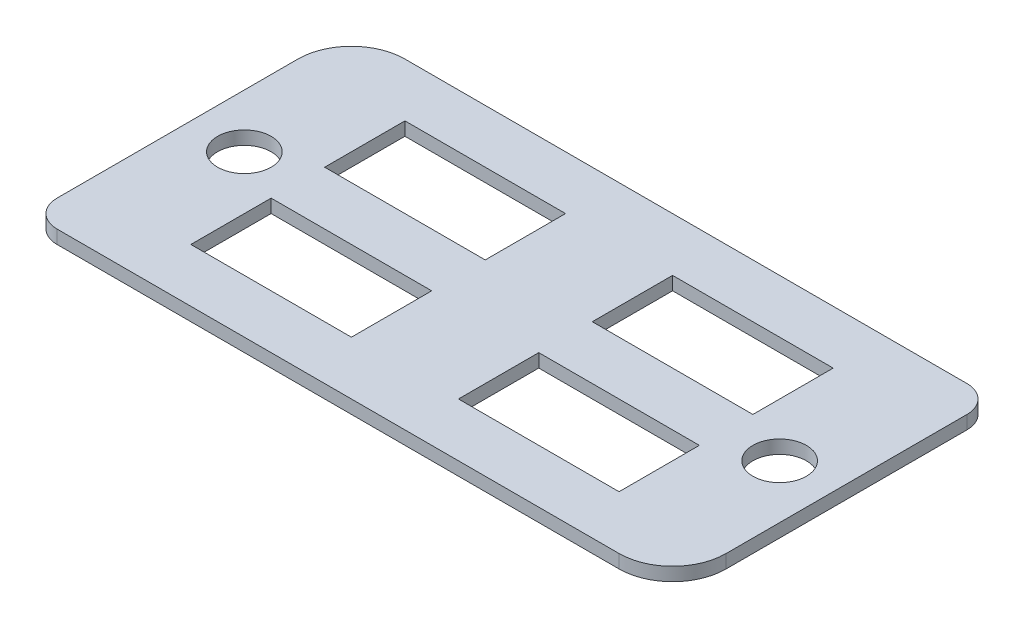
ISO-10303-21;
HEADER;
FILE_DESCRIPTION(('STEP AP214'),'2;1');
FILE_NAME('part.step','',(''),(''),'','','');
FILE_SCHEMA(('AUTOMOTIVE_DESIGN { 1 0 10303 214 1 1 1 1 }'));
ENDSEC;
DATA;
#1=APPLICATION_CONTEXT('core data for automotive mechanical design processes');
#2=APPLICATION_PROTOCOL_DEFINITION('international standard','automotive_design',2000,#1);
#3=PRODUCT_CONTEXT('',#1,'mechanical');
#4=PRODUCT('Part','Part','',(#3));
#5=PRODUCT_RELATED_PRODUCT_CATEGORY('part','',(#4));
#6=PRODUCT_DEFINITION_FORMATION('','',#4);
#7=PRODUCT_DEFINITION_CONTEXT('part definition',#1,'design');
#8=PRODUCT_DEFINITION('design','',#6,#7);
#9=PRODUCT_DEFINITION_SHAPE('','',#8);
#10=(LENGTH_UNIT() NAMED_UNIT(*) SI_UNIT(.MILLI.,.METRE.));
#11=(NAMED_UNIT(*) PLANE_ANGLE_UNIT() SI_UNIT($,.RADIAN.));
#12=(NAMED_UNIT(*) SI_UNIT($,.STERADIAN.) SOLID_ANGLE_UNIT());
#13=UNCERTAINTY_MEASURE_WITH_UNIT(LENGTH_MEASURE(1.E-05),#10,'distance_accuracy_value','');
#14=(GEOMETRIC_REPRESENTATION_CONTEXT(3) GLOBAL_UNCERTAINTY_ASSIGNED_CONTEXT((#13)) GLOBAL_UNIT_ASSIGNED_CONTEXT((#10,
#11,#12)) REPRESENTATION_CONTEXT('',''));
#15=CARTESIAN_POINT('',(0.,0.,0.));
#16=DIRECTION('',(0.,0.,1.));
#17=DIRECTION('',(1.,0.,0.));
#18=AXIS2_PLACEMENT_3D('',#15,#16,#17);
#19=CARTESIAN_POINT('',(0.,6.35,0.));
#20=DIRECTION('',(0.,-1.,0.));
#21=DIRECTION('',(0.,0.,-1.));
#22=AXIS2_PLACEMENT_3D('',#19,#20,#21);
#23=PLANE('',#22);
#24=DIRECTION('',(0.,0.,1.));
#25=VECTOR('',#24,1.);
#26=CARTESIAN_POINT('',(177.8,6.35,-127.));
#27=LINE('',#26,#25);
#28=CARTESIAN_POINT('',(177.8,6.35,-127.));
#29=VERTEX_POINT('',#28);
#30=CARTESIAN_POINT('',(177.8,6.35,-88.9));
#31=VERTEX_POINT('',#30);
#32=EDGE_CURVE('E236',#29,#31,#27,.T.);
#33=ORIENTED_EDGE('',*,*,#32,.F.);
#34=DIRECTION('',(-1.,0.,0.));
#35=VECTOR('',#34,1.);
#36=CARTESIAN_POINT('',(177.8,6.35,-127.));
#37=LINE('',#36,#35);
#38=CARTESIAN_POINT('',(254.,6.35,-127.));
#39=VERTEX_POINT('',#38);
#40=EDGE_CURVE('E244',#39,#29,#37,.T.);
#41=ORIENTED_EDGE('',*,*,#40,.F.);
#42=DIRECTION('',(0.,0.,-1.));
#43=VECTOR('',#42,1.);
#44=CARTESIAN_POINT('',(254.,6.35,-127.));
#45=LINE('',#44,#43);
#46=CARTESIAN_POINT('',(254.,6.35,-88.9));
#47=VERTEX_POINT('',#46);
#48=EDGE_CURVE('E241',#47,#39,#45,.T.);
#49=ORIENTED_EDGE('',*,*,#48,.F.);
#50=DIRECTION('',(1.,0.,0.));
#51=VECTOR('',#50,1.);
#52=CARTESIAN_POINT('',(177.8,6.35,-88.9));
#53=LINE('',#52,#51);
#54=EDGE_CURVE('E238',#31,#47,#53,.T.);
#55=ORIENTED_EDGE('',*,*,#54,.F.);
#56=EDGE_LOOP('',(#33,#41,#49,#55));
#57=FACE_BOUND('',#56,.T.);
#58=CARTESIAN_POINT('',(25.4,6.35,-76.2));
#59=DIRECTION('',(0.,1.,0.));
#60=DIRECTION('',(0.,0.,1.));
#61=AXIS2_PLACEMENT_3D('',#58,#59,#60);
#62=CIRCLE('',#61,12.7);
#63=CARTESIAN_POINT('',(25.4,6.35,-63.5));
#64=VERTEX_POINT('',#63);
#65=EDGE_CURVE('E304',#64,#64,#62,.T.);
#66=ORIENTED_EDGE('',*,*,#65,.F.);
#67=EDGE_LOOP('',(#66));
#68=FACE_BOUND('',#67,.T.);
#69=DIRECTION('',(0.,0.,1.));
#70=VECTOR('',#69,1.);
#71=CARTESIAN_POINT('',(50.8,6.35,-127.));
#72=LINE('',#71,#70);
#73=CARTESIAN_POINT('',(50.8,6.35,-127.));
#74=VERTEX_POINT('',#73);
#75=CARTESIAN_POINT('',(50.8,6.35,-88.9));
#76=VERTEX_POINT('',#75);
#77=EDGE_CURVE('E310',#74,#76,#72,.T.);
#78=ORIENTED_EDGE('',*,*,#77,.F.);
#79=DIRECTION('',(-1.,0.,0.));
#80=VECTOR('',#79,1.);
#81=CARTESIAN_POINT('',(50.8,6.35,-127.));
#82=LINE('',#81,#80);
#83=CARTESIAN_POINT('',(127.,6.35,-127.));
#84=VERTEX_POINT('',#83);
#85=EDGE_CURVE('E318',#84,#74,#82,.T.);
#86=ORIENTED_EDGE('',*,*,#85,.F.);
#87=DIRECTION('',(0.,0.,-1.));
#88=VECTOR('',#87,1.);
#89=CARTESIAN_POINT('',(127.,6.35,-127.));
#90=LINE('',#89,#88);
#91=CARTESIAN_POINT('',(127.,6.35,-88.9));
#92=VERTEX_POINT('',#91);
#93=EDGE_CURVE('E315',#92,#84,#90,.T.);
#94=ORIENTED_EDGE('',*,*,#93,.F.);
#95=DIRECTION('',(1.,0.,0.));
#96=VECTOR('',#95,1.);
#97=CARTESIAN_POINT('',(50.8,6.35,-88.9));
#98=LINE('',#97,#96);
#99=EDGE_CURVE('E312',#76,#92,#98,.T.);
#100=ORIENTED_EDGE('',*,*,#99,.F.);
#101=EDGE_LOOP('',(#78,#86,#94,#100));
#102=FACE_BOUND('',#101,.T.);
#103=DIRECTION('',(0.,0.,-1.));
#104=VECTOR('',#103,1.);
#105=CARTESIAN_POINT('',(304.8,6.35,0.));
#106=LINE('',#105,#104);
#107=CARTESIAN_POINT('',(304.8,6.35,-25.4));
#108=VERTEX_POINT('',#107);
#109=CARTESIAN_POINT('',(304.8,6.35,-139.7));
#110=VERTEX_POINT('',#109);
#111=EDGE_CURVE('E346',#108,#110,#106,.T.);
#112=ORIENTED_EDGE('',*,*,#111,.T.);
#113=CARTESIAN_POINT('',(292.1,6.35,-139.7));
#114=DIRECTION('',(0.,-1.,0.));
#115=DIRECTION('',(0.,0.,-1.));
#116=AXIS2_PLACEMENT_3D('',#113,#114,#115);
#117=CIRCLE('',#116,12.7);
#118=CARTESIAN_POINT('',(292.1,6.35,-152.4));
#119=VERTEX_POINT('',#118);
#120=EDGE_CURVE('E390',#110,#119,#117,.F.);
#121=ORIENTED_EDGE('',*,*,#120,.T.);
#122=DIRECTION('',(-1.,0.,0.));
#123=VECTOR('',#122,1.);
#124=CARTESIAN_POINT('',(0.,6.35,-152.4));
#125=LINE('',#124,#123);
#126=CARTESIAN_POINT('',(25.4,6.35,-152.4));
#127=VERTEX_POINT('',#126);
#128=EDGE_CURVE('E349',#119,#127,#125,.T.);
#129=ORIENTED_EDGE('',*,*,#128,.T.);
#130=CARTESIAN_POINT('',(25.4,6.35,-127.));
#131=DIRECTION('',(0.,-1.,0.));
#132=DIRECTION('',(0.,0.,-1.));
#133=AXIS2_PLACEMENT_3D('',#130,#131,#132);
#134=CIRCLE('',#133,25.4);
#135=CARTESIAN_POINT('',(0.,6.35,-127.));
#136=VERTEX_POINT('',#135);
#137=EDGE_CURVE('E370',#127,#136,#134,.F.);
#138=ORIENTED_EDGE('',*,*,#137,.T.);
#139=DIRECTION('',(0.,0.,1.));
#140=VECTOR('',#139,1.);
#141=CARTESIAN_POINT('',(0.,6.35,0.));
#142=LINE('',#141,#140);
#143=CARTESIAN_POINT('',(0.,6.35,-12.7));
#144=VERTEX_POINT('',#143);
#145=EDGE_CURVE('E341',#136,#144,#142,.T.);
#146=ORIENTED_EDGE('',*,*,#145,.T.);
#147=CARTESIAN_POINT('',(12.7,6.35,-12.7));
#148=DIRECTION('',(0.,-1.,0.));
#149=DIRECTION('',(0.,0.,-1.));
#150=AXIS2_PLACEMENT_3D('',#147,#148,#149);
#151=CIRCLE('',#150,12.7);
#152=CARTESIAN_POINT('',(12.7,6.35,0.));
#153=VERTEX_POINT('',#152);
#154=EDGE_CURVE('E53',#144,#153,#151,.F.);
#155=ORIENTED_EDGE('',*,*,#154,.T.);
#156=DIRECTION('',(1.,0.,0.));
#157=VECTOR('',#156,1.);
#158=CARTESIAN_POINT('',(0.,6.35,0.));
#159=LINE('',#158,#157);
#160=CARTESIAN_POINT('',(279.4,6.35,0.));
#161=VERTEX_POINT('',#160);
#162=EDGE_CURVE('E343',#153,#161,#159,.T.);
#163=ORIENTED_EDGE('',*,*,#162,.T.);
#164=CARTESIAN_POINT('',(279.4,6.35,-25.4));
#165=DIRECTION('',(0.,-1.,0.));
#166=DIRECTION('',(0.,0.,-1.));
#167=AXIS2_PLACEMENT_3D('',#164,#165,#166);
#168=CIRCLE('',#167,25.4);
#169=EDGE_CURVE('E372',#161,#108,#168,.F.);
#170=ORIENTED_EDGE('',*,*,#169,.T.);
#171=EDGE_LOOP('',(#112,#121,#129,#138,#146,#155,#163,#170));
#172=FACE_BOUND('',#171,.T.);
#173=DIRECTION('',(0.,0.,1.));
#174=VECTOR('',#173,1.);
#175=CARTESIAN_POINT('',(50.8,6.35,-63.5));
#176=LINE('',#175,#174);
#177=CARTESIAN_POINT('',(50.8,6.35,-63.5));
#178=VERTEX_POINT('',#177);
#179=CARTESIAN_POINT('',(50.8,6.35,-25.4));
#180=VERTEX_POINT('',#179);
#181=EDGE_CURVE('E273',#178,#180,#176,.T.);
#182=ORIENTED_EDGE('',*,*,#181,.F.);
#183=DIRECTION('',(-1.,0.,0.));
#184=VECTOR('',#183,1.);
#185=CARTESIAN_POINT('',(50.8,6.35,-63.5));
#186=LINE('',#185,#184);
#187=CARTESIAN_POINT('',(127.,6.35,-63.5));
#188=VERTEX_POINT('',#187);
#189=EDGE_CURVE('E281',#188,#178,#186,.T.);
#190=ORIENTED_EDGE('',*,*,#189,.F.);
#191=DIRECTION('',(0.,0.,-1.));
#192=VECTOR('',#191,1.);
#193=CARTESIAN_POINT('',(127.,6.35,-63.5));
#194=LINE('',#193,#192);
#195=CARTESIAN_POINT('',(127.,6.35,-25.4));
#196=VERTEX_POINT('',#195);
#197=EDGE_CURVE('E278',#196,#188,#194,.T.);
#198=ORIENTED_EDGE('',*,*,#197,.F.);
#199=DIRECTION('',(1.,0.,0.));
#200=VECTOR('',#199,1.);
#201=CARTESIAN_POINT('',(50.8,6.35,-25.4));
#202=LINE('',#201,#200);
#203=EDGE_CURVE('E275',#180,#196,#202,.T.);
#204=ORIENTED_EDGE('',*,*,#203,.F.);
#205=EDGE_LOOP('',(#182,#190,#198,#204));
#206=FACE_BOUND('',#205,.T.);
#207=CARTESIAN_POINT('',(279.4,6.35,-76.2));
#208=DIRECTION('',(0.,1.,0.));
#209=DIRECTION('',(0.,0.,1.));
#210=AXIS2_PLACEMENT_3D('',#207,#208,#209);
#211=CIRCLE('',#210,12.7);
#212=CARTESIAN_POINT('',(279.4,6.35,-63.5));
#213=VERTEX_POINT('',#212);
#214=EDGE_CURVE('E267',#213,#213,#211,.T.);
#215=ORIENTED_EDGE('',*,*,#214,.F.);
#216=EDGE_LOOP('',(#215));
#217=FACE_BOUND('',#216,.T.);
#218=DIRECTION('',(0.,0.,1.));
#219=VECTOR('',#218,1.);
#220=CARTESIAN_POINT('',(177.8,6.35,-63.5));
#221=LINE('',#220,#219);
#222=CARTESIAN_POINT('',(177.8,6.35,-63.5));
#223=VERTEX_POINT('',#222);
#224=CARTESIAN_POINT('',(177.8,6.35,-25.4));
#225=VERTEX_POINT('',#224);
#226=EDGE_CURVE('E195',#223,#225,#221,.T.);
#227=ORIENTED_EDGE('',*,*,#226,.F.);
#228=DIRECTION('',(-1.,0.,0.));
#229=VECTOR('',#228,1.);
#230=CARTESIAN_POINT('',(177.8,6.35,-63.5));
#231=LINE('',#230,#229);
#232=CARTESIAN_POINT('',(254.,6.35,-63.5));
#233=VERTEX_POINT('',#232);
#234=EDGE_CURVE('E220',#233,#223,#231,.T.);
#235=ORIENTED_EDGE('',*,*,#234,.F.);
#236=DIRECTION('',(0.,0.,-1.));
#237=VECTOR('',#236,1.);
#238=CARTESIAN_POINT('',(254.,6.35,-63.5));
#239=LINE('',#238,#237);
#240=CARTESIAN_POINT('',(254.,6.35,-25.4));
#241=VERTEX_POINT('',#240);
#242=EDGE_CURVE('E218',#241,#233,#239,.T.);
#243=ORIENTED_EDGE('',*,*,#242,.F.);
#244=DIRECTION('',(1.,0.,0.));
#245=VECTOR('',#244,1.);
#246=CARTESIAN_POINT('',(177.8,6.35,-25.4));
#247=LINE('',#246,#245);
#248=EDGE_CURVE('E205',#225,#241,#247,.T.);
#249=ORIENTED_EDGE('',*,*,#248,.F.);
#250=EDGE_LOOP('',(#227,#235,#243,#249));
#251=FACE_BOUND('',#250,.T.);
#252=ADVANCED_FACE('F33',(#57,#68,#102,#172,#206,#217,#251),#23,.F.);
#253=CARTESIAN_POINT('',(0.,0.,0.));
#254=DIRECTION('',(0.,-1.,0.));
#255=DIRECTION('',(0.,0.,-1.));
#256=AXIS2_PLACEMENT_3D('',#253,#254,#255);
#257=PLANE('',#256);
#258=DIRECTION('',(-1.,0.,0.));
#259=VECTOR('',#258,1.);
#260=CARTESIAN_POINT('',(50.8,0.,-63.5));
#261=LINE('',#260,#259);
#262=CARTESIAN_POINT('',(127.,0.,-63.5));
#263=VERTEX_POINT('',#262);
#264=CARTESIAN_POINT('',(50.8,0.,-63.5));
#265=VERTEX_POINT('',#264);
#266=EDGE_CURVE('E276',#263,#265,#261,.T.);
#267=ORIENTED_EDGE('',*,*,#266,.T.);
#268=DIRECTION('',(0.,0.,1.));
#269=VECTOR('',#268,1.);
#270=CARTESIAN_POINT('',(50.8,0.,-63.5));
#271=LINE('',#270,#269);
#272=CARTESIAN_POINT('',(50.8,0.,-25.4));
#273=VERTEX_POINT('',#272);
#274=EDGE_CURVE('E270',#265,#273,#271,.T.);
#275=ORIENTED_EDGE('',*,*,#274,.T.);
#276=DIRECTION('',(1.,0.,0.));
#277=VECTOR('',#276,1.);
#278=CARTESIAN_POINT('',(50.8,0.,-25.4));
#279=LINE('',#278,#277);
#280=CARTESIAN_POINT('',(127.,0.,-25.4));
#281=VERTEX_POINT('',#280);
#282=EDGE_CURVE('E286',#273,#281,#279,.T.);
#283=ORIENTED_EDGE('',*,*,#282,.T.);
#284=DIRECTION('',(0.,0.,-1.));
#285=VECTOR('',#284,1.);
#286=CARTESIAN_POINT('',(127.,0.,-63.5));
#287=LINE('',#286,#285);
#288=EDGE_CURVE('E289',#281,#263,#287,.T.);
#289=ORIENTED_EDGE('',*,*,#288,.T.);
#290=EDGE_LOOP('',(#267,#275,#283,#289));
#291=FACE_BOUND('',#290,.T.);
#292=CARTESIAN_POINT('',(25.4,0.,-76.2));
#293=DIRECTION('',(0.,1.,0.));
#294=DIRECTION('',(0.,0.,1.));
#295=AXIS2_PLACEMENT_3D('',#292,#293,#294);
#296=CIRCLE('',#295,12.7);
#297=CARTESIAN_POINT('',(25.4,0.,-63.5));
#298=VERTEX_POINT('',#297);
#299=EDGE_CURVE('E303',#298,#298,#296,.T.);
#300=ORIENTED_EDGE('',*,*,#299,.T.);
#301=EDGE_LOOP('',(#300));
#302=FACE_BOUND('',#301,.T.);
#303=DIRECTION('',(-1.,0.,0.));
#304=VECTOR('',#303,1.);
#305=CARTESIAN_POINT('',(0.,0.,-152.4));
#306=LINE('',#305,#304);
#307=CARTESIAN_POINT('',(292.1,0.,-152.4));
#308=VERTEX_POINT('',#307);
#309=CARTESIAN_POINT('',(25.4,0.,-152.4));
#310=VERTEX_POINT('',#309);
#311=EDGE_CURVE('E344',#308,#310,#306,.T.);
#312=ORIENTED_EDGE('',*,*,#311,.F.);
#313=CARTESIAN_POINT('',(292.1,0.,-139.7));
#314=DIRECTION('',(0.,-1.,0.));
#315=DIRECTION('',(0.,0.,-1.));
#316=AXIS2_PLACEMENT_3D('',#313,#314,#315);
#317=CIRCLE('',#316,12.7);
#318=CARTESIAN_POINT('',(304.8,0.,-139.7));
#319=VERTEX_POINT('',#318);
#320=EDGE_CURVE('E385',#308,#319,#317,.T.);
#321=ORIENTED_EDGE('',*,*,#320,.T.);
#322=DIRECTION('',(0.,0.,-1.));
#323=VECTOR('',#322,1.);
#324=CARTESIAN_POINT('',(304.8,0.,0.));
#325=LINE('',#324,#323);
#326=CARTESIAN_POINT('',(304.8,0.,-25.4));
#327=VERTEX_POINT('',#326);
#328=EDGE_CURVE('E355',#327,#319,#325,.T.);
#329=ORIENTED_EDGE('',*,*,#328,.F.);
#330=CARTESIAN_POINT('',(279.4,0.,-25.4));
#331=DIRECTION('',(0.,-1.,0.));
#332=DIRECTION('',(0.,0.,-1.));
#333=AXIS2_PLACEMENT_3D('',#330,#331,#332);
#334=CIRCLE('',#333,25.4);
#335=CARTESIAN_POINT('',(279.4,0.,0.));
#336=VERTEX_POINT('',#335);
#337=EDGE_CURVE('E364',#327,#336,#334,.T.);
#338=ORIENTED_EDGE('',*,*,#337,.T.);
#339=DIRECTION('',(1.,0.,0.));
#340=VECTOR('',#339,1.);
#341=CARTESIAN_POINT('',(0.,0.,0.));
#342=LINE('',#341,#340);
#343=CARTESIAN_POINT('',(12.7,0.,0.));
#344=VERTEX_POINT('',#343);
#345=EDGE_CURVE('E353',#344,#336,#342,.T.);
#346=ORIENTED_EDGE('',*,*,#345,.F.);
#347=CARTESIAN_POINT('',(12.7,0.,-12.7));
#348=DIRECTION('',(0.,-1.,0.));
#349=DIRECTION('',(0.,0.,-1.));
#350=AXIS2_PLACEMENT_3D('',#347,#348,#349);
#351=CIRCLE('',#350,12.7);
#352=CARTESIAN_POINT('',(0.,0.,-12.7));
#353=VERTEX_POINT('',#352);
#354=EDGE_CURVE('E383',#344,#353,#351,.T.);
#355=ORIENTED_EDGE('',*,*,#354,.T.);
#356=DIRECTION('',(0.,0.,1.));
#357=VECTOR('',#356,1.);
#358=CARTESIAN_POINT('',(0.,0.,0.));
#359=LINE('',#358,#357);
#360=CARTESIAN_POINT('',(0.,0.,-127.));
#361=VERTEX_POINT('',#360);
#362=EDGE_CURVE('E340',#361,#353,#359,.T.);
#363=ORIENTED_EDGE('',*,*,#362,.F.);
#364=CARTESIAN_POINT('',(25.4,0.,-127.));
#365=DIRECTION('',(0.,-1.,0.));
#366=DIRECTION('',(0.,0.,-1.));
#367=AXIS2_PLACEMENT_3D('',#364,#365,#366);
#368=CIRCLE('',#367,25.4);
#369=EDGE_CURVE('E361',#361,#310,#368,.T.);
#370=ORIENTED_EDGE('',*,*,#369,.T.);
#371=EDGE_LOOP('',(#312,#321,#329,#338,#346,#355,#363,#370));
#372=FACE_BOUND('',#371,.T.);
#373=DIRECTION('',(-1.,0.,0.));
#374=VECTOR('',#373,1.);
#375=CARTESIAN_POINT('',(50.8,0.,-127.));
#376=LINE('',#375,#374);
#377=CARTESIAN_POINT('',(127.,0.,-127.));
#378=VERTEX_POINT('',#377);
#379=CARTESIAN_POINT('',(50.8,0.,-127.));
#380=VERTEX_POINT('',#379);
#381=EDGE_CURVE('E313',#378,#380,#376,.T.);
#382=ORIENTED_EDGE('',*,*,#381,.T.);
#383=DIRECTION('',(0.,0.,1.));
#384=VECTOR('',#383,1.);
#385=CARTESIAN_POINT('',(50.8,0.,-127.));
#386=LINE('',#385,#384);
#387=CARTESIAN_POINT('',(50.8,0.,-88.9));
#388=VERTEX_POINT('',#387);
#389=EDGE_CURVE('E307',#380,#388,#386,.T.);
#390=ORIENTED_EDGE('',*,*,#389,.T.);
#391=DIRECTION('',(1.,0.,0.));
#392=VECTOR('',#391,1.);
#393=CARTESIAN_POINT('',(50.8,0.,-88.9));
#394=LINE('',#393,#392);
#395=CARTESIAN_POINT('',(127.,0.,-88.9));
#396=VERTEX_POINT('',#395);
#397=EDGE_CURVE('E323',#388,#396,#394,.T.);
#398=ORIENTED_EDGE('',*,*,#397,.T.);
#399=DIRECTION('',(0.,0.,-1.));
#400=VECTOR('',#399,1.);
#401=CARTESIAN_POINT('',(127.,0.,-127.));
#402=LINE('',#401,#400);
#403=EDGE_CURVE('E326',#396,#378,#402,.T.);
#404=ORIENTED_EDGE('',*,*,#403,.T.);
#405=EDGE_LOOP('',(#382,#390,#398,#404));
#406=FACE_BOUND('',#405,.T.);
#407=CARTESIAN_POINT('',(279.4,0.,-76.2));
#408=DIRECTION('',(0.,1.,0.));
#409=DIRECTION('',(0.,0.,1.));
#410=AXIS2_PLACEMENT_3D('',#407,#408,#409);
#411=CIRCLE('',#410,12.7);
#412=CARTESIAN_POINT('',(279.4,0.,-63.5));
#413=VERTEX_POINT('',#412);
#414=EDGE_CURVE('E266',#413,#413,#411,.T.);
#415=ORIENTED_EDGE('',*,*,#414,.T.);
#416=EDGE_LOOP('',(#415));
#417=FACE_BOUND('',#416,.T.);
#418=DIRECTION('',(-1.,0.,0.));
#419=VECTOR('',#418,1.);
#420=CARTESIAN_POINT('',(177.8,0.,-127.));
#421=LINE('',#420,#419);
#422=CARTESIAN_POINT('',(254.,0.,-127.));
#423=VERTEX_POINT('',#422);
#424=CARTESIAN_POINT('',(177.8,0.,-127.));
#425=VERTEX_POINT('',#424);
#426=EDGE_CURVE('E239',#423,#425,#421,.T.);
#427=ORIENTED_EDGE('',*,*,#426,.T.);
#428=DIRECTION('',(0.,0.,1.));
#429=VECTOR('',#428,1.);
#430=CARTESIAN_POINT('',(177.8,0.,-127.));
#431=LINE('',#430,#429);
#432=CARTESIAN_POINT('',(177.8,0.,-88.9));
#433=VERTEX_POINT('',#432);
#434=EDGE_CURVE('E213',#425,#433,#431,.T.);
#435=ORIENTED_EDGE('',*,*,#434,.T.);
#436=DIRECTION('',(1.,0.,0.));
#437=VECTOR('',#436,1.);
#438=CARTESIAN_POINT('',(177.8,0.,-88.9));
#439=LINE('',#438,#437);
#440=CARTESIAN_POINT('',(254.,0.,-88.9));
#441=VERTEX_POINT('',#440);
#442=EDGE_CURVE('E249',#433,#441,#439,.T.);
#443=ORIENTED_EDGE('',*,*,#442,.T.);
#444=DIRECTION('',(0.,0.,-1.));
#445=VECTOR('',#444,1.);
#446=CARTESIAN_POINT('',(254.,0.,-127.));
#447=LINE('',#446,#445);
#448=EDGE_CURVE('E252',#441,#423,#447,.T.);
#449=ORIENTED_EDGE('',*,*,#448,.T.);
#450=EDGE_LOOP('',(#427,#435,#443,#449));
#451=FACE_BOUND('',#450,.T.);
#452=DIRECTION('',(-1.,0.,0.));
#453=VECTOR('',#452,1.);
#454=CARTESIAN_POINT('',(177.8,0.,-63.5));
#455=LINE('',#454,#453);
#456=CARTESIAN_POINT('',(254.,0.,-63.5));
#457=VERTEX_POINT('',#456);
#458=CARTESIAN_POINT('',(177.8,0.,-63.5));
#459=VERTEX_POINT('',#458);
#460=EDGE_CURVE('E206',#457,#459,#455,.T.);
#461=ORIENTED_EDGE('',*,*,#460,.T.);
#462=DIRECTION('',(0.,0.,1.));
#463=VECTOR('',#462,1.);
#464=CARTESIAN_POINT('',(177.8,0.,-63.5));
#465=LINE('',#464,#463);
#466=CARTESIAN_POINT('',(177.8,0.,-25.4));
#467=VERTEX_POINT('',#466);
#468=EDGE_CURVE('E224',#459,#467,#465,.T.);
#469=ORIENTED_EDGE('',*,*,#468,.T.);
#470=DIRECTION('',(1.,0.,0.));
#471=VECTOR('',#470,1.);
#472=CARTESIAN_POINT('',(177.8,0.,-25.4));
#473=LINE('',#472,#471);
#474=CARTESIAN_POINT('',(254.,0.,-25.4));
#475=VERTEX_POINT('',#474);
#476=EDGE_CURVE('E212',#467,#475,#473,.T.);
#477=ORIENTED_EDGE('',*,*,#476,.T.);
#478=DIRECTION('',(0.,0.,-1.));
#479=VECTOR('',#478,1.);
#480=CARTESIAN_POINT('',(254.,0.,-63.5));
#481=LINE('',#480,#479);
#482=EDGE_CURVE('E227',#475,#457,#481,.T.);
#483=ORIENTED_EDGE('',*,*,#482,.T.);
#484=EDGE_LOOP('',(#461,#469,#477,#483));
#485=FACE_BOUND('',#484,.T.);
#486=ADVANCED_FACE('F399',(#291,#302,#372,#406,#417,#451,#485),#257,.T.);
#487=CARTESIAN_POINT('',(0.,6.35,0.));
#488=DIRECTION('',(1.,0.,0.));
#489=DIRECTION('',(0.,0.,-1.));
#490=AXIS2_PLACEMENT_3D('',#487,#488,#489);
#491=PLANE('',#490);
#492=ORIENTED_EDGE('',*,*,#362,.T.);
#493=DIRECTION('',(0.,-1.,0.));
#494=VECTOR('',#493,1.);
#495=CARTESIAN_POINT('',(0.,6.35,-12.7));
#496=LINE('',#495,#494);
#497=EDGE_CURVE('E11',#353,#144,#496,.F.);
#498=ORIENTED_EDGE('',*,*,#497,.T.);
#499=ORIENTED_EDGE('',*,*,#145,.F.);
#500=DIRECTION('',(0.,-1.,0.));
#501=VECTOR('',#500,1.);
#502=CARTESIAN_POINT('',(0.,6.35,-127.));
#503=LINE('',#502,#501);
#504=EDGE_CURVE('E374',#136,#361,#503,.T.);
#505=ORIENTED_EDGE('',*,*,#504,.T.);
#506=EDGE_LOOP('',(#492,#498,#499,#505));
#507=FACE_BOUND('',#506,.T.);
#508=ADVANCED_FACE('F425',(#507),#491,.F.);
#509=CARTESIAN_POINT('',(0.,6.35,0.));
#510=DIRECTION('',(0.,0.,-1.));
#511=DIRECTION('',(-1.,0.,0.));
#512=AXIS2_PLACEMENT_3D('',#509,#510,#511);
#513=PLANE('',#512);
#514=ORIENTED_EDGE('',*,*,#162,.F.);
#515=DIRECTION('',(0.,-1.,0.));
#516=VECTOR('',#515,1.);
#517=CARTESIAN_POINT('',(12.7,6.35,0.));
#518=LINE('',#517,#516);
#519=EDGE_CURVE('E41',#153,#344,#518,.T.);
#520=ORIENTED_EDGE('',*,*,#519,.T.);
#521=ORIENTED_EDGE('',*,*,#345,.T.);
#522=DIRECTION('',(0.,-1.,0.));
#523=VECTOR('',#522,1.);
#524=CARTESIAN_POINT('',(279.4,6.35,0.));
#525=LINE('',#524,#523);
#526=EDGE_CURVE('E367',#336,#161,#525,.F.);
#527=ORIENTED_EDGE('',*,*,#526,.T.);
#528=EDGE_LOOP('',(#514,#520,#521,#527));
#529=FACE_BOUND('',#528,.T.);
#530=ADVANCED_FACE('F395',(#529),#513,.F.);
#531=CARTESIAN_POINT('',(304.8,6.35,0.));
#532=DIRECTION('',(-1.,0.,0.));
#533=DIRECTION('',(0.,0.,1.));
#534=AXIS2_PLACEMENT_3D('',#531,#532,#533);
#535=PLANE('',#534);
#536=ORIENTED_EDGE('',*,*,#328,.T.);
#537=DIRECTION('',(0.,-1.,0.));
#538=VECTOR('',#537,1.);
#539=CARTESIAN_POINT('',(304.8,6.35,-139.7));
#540=LINE('',#539,#538);
#541=EDGE_CURVE('E387',#319,#110,#540,.F.);
#542=ORIENTED_EDGE('',*,*,#541,.T.);
#543=ORIENTED_EDGE('',*,*,#111,.F.);
#544=DIRECTION('',(0.,-1.,0.));
#545=VECTOR('',#544,1.);
#546=CARTESIAN_POINT('',(304.8,6.35,-25.4));
#547=LINE('',#546,#545);
#548=EDGE_CURVE('E351',#108,#327,#547,.T.);
#549=ORIENTED_EDGE('',*,*,#548,.T.);
#550=EDGE_LOOP('',(#536,#542,#543,#549));
#551=FACE_BOUND('',#550,.T.);
#552=ADVANCED_FACE('F412',(#551),#535,.F.);
#553=CARTESIAN_POINT('',(0.,6.35,-152.4));
#554=DIRECTION('',(0.,0.,1.));
#555=DIRECTION('',(1.,0.,0.));
#556=AXIS2_PLACEMENT_3D('',#553,#554,#555);
#557=PLANE('',#556);
#558=ORIENTED_EDGE('',*,*,#128,.F.);
#559=DIRECTION('',(0.,-1.,0.));
#560=VECTOR('',#559,1.);
#561=CARTESIAN_POINT('',(292.1,6.35,-152.4));
#562=LINE('',#561,#560);
#563=EDGE_CURVE('E380',#119,#308,#562,.T.);
#564=ORIENTED_EDGE('',*,*,#563,.T.);
#565=ORIENTED_EDGE('',*,*,#311,.T.);
#566=DIRECTION('',(0.,-1.,0.));
#567=VECTOR('',#566,1.);
#568=CARTESIAN_POINT('',(25.4,6.35,-152.4));
#569=LINE('',#568,#567);
#570=EDGE_CURVE('E377',#310,#127,#569,.F.);
#571=ORIENTED_EDGE('',*,*,#570,.T.);
#572=EDGE_LOOP('',(#558,#564,#565,#571));
#573=FACE_BOUND('',#572,.T.);
#574=ADVANCED_FACE('F419',(#573),#557,.F.);
#575=CARTESIAN_POINT('',(50.8,6.35,-127.));
#576=DIRECTION('',(1.,0.,0.));
#577=DIRECTION('',(0.,0.,-1.));
#578=AXIS2_PLACEMENT_3D('',#575,#576,#577);
#579=PLANE('',#578);
#580=ORIENTED_EDGE('',*,*,#389,.F.);
#581=DIRECTION('',(0.,-1.,0.));
#582=VECTOR('',#581,1.);
#583=CARTESIAN_POINT('',(50.8,6.35,-127.));
#584=LINE('',#583,#582);
#585=EDGE_CURVE('E320',#74,#380,#584,.T.);
#586=ORIENTED_EDGE('',*,*,#585,.F.);
#587=ORIENTED_EDGE('',*,*,#77,.T.);
#588=DIRECTION('',(0.,-1.,0.));
#589=VECTOR('',#588,1.);
#590=CARTESIAN_POINT('',(50.8,6.35,-88.9));
#591=LINE('',#590,#589);
#592=EDGE_CURVE('E337',#76,#388,#591,.T.);
#593=ORIENTED_EDGE('',*,*,#592,.T.);
#594=EDGE_LOOP('',(#580,#586,#587,#593));
#595=FACE_BOUND('',#594,.T.);
#596=ADVANCED_FACE('F441',(#595),#579,.T.);
#597=CARTESIAN_POINT('',(50.8,6.35,-88.9));
#598=DIRECTION('',(0.,0.,-1.));
#599=DIRECTION('',(-1.,0.,0.));
#600=AXIS2_PLACEMENT_3D('',#597,#598,#599);
#601=PLANE('',#600);
#602=ORIENTED_EDGE('',*,*,#397,.F.);
#603=ORIENTED_EDGE('',*,*,#592,.F.);
#604=ORIENTED_EDGE('',*,*,#99,.T.);
#605=DIRECTION('',(0.,-1.,0.));
#606=VECTOR('',#605,1.);
#607=CARTESIAN_POINT('',(127.,6.35,-88.9));
#608=LINE('',#607,#606);
#609=EDGE_CURVE('E335',#92,#396,#608,.T.);
#610=ORIENTED_EDGE('',*,*,#609,.T.);
#611=EDGE_LOOP('',(#602,#603,#604,#610));
#612=FACE_BOUND('',#611,.T.);
#613=ADVANCED_FACE('F512',(#612),#601,.T.);
#614=CARTESIAN_POINT('',(127.,6.35,-127.));
#615=DIRECTION('',(-1.,0.,0.));
#616=DIRECTION('',(0.,0.,1.));
#617=AXIS2_PLACEMENT_3D('',#614,#615,#616);
#618=PLANE('',#617);
#619=ORIENTED_EDGE('',*,*,#403,.F.);
#620=ORIENTED_EDGE('',*,*,#609,.F.);
#621=ORIENTED_EDGE('',*,*,#93,.T.);
#622=DIRECTION('',(0.,-1.,0.));
#623=VECTOR('',#622,1.);
#624=CARTESIAN_POINT('',(127.,6.35,-127.));
#625=LINE('',#624,#623);
#626=EDGE_CURVE('E333',#84,#378,#625,.T.);
#627=ORIENTED_EDGE('',*,*,#626,.T.);
#628=EDGE_LOOP('',(#619,#620,#621,#627));
#629=FACE_BOUND('',#628,.T.);
#630=ADVANCED_FACE('F518',(#629),#618,.T.);
#631=CARTESIAN_POINT('',(50.8,6.35,-127.));
#632=DIRECTION('',(0.,0.,1.));
#633=DIRECTION('',(1.,0.,0.));
#634=AXIS2_PLACEMENT_3D('',#631,#632,#633);
#635=PLANE('',#634);
#636=ORIENTED_EDGE('',*,*,#381,.F.);
#637=ORIENTED_EDGE('',*,*,#626,.F.);
#638=ORIENTED_EDGE('',*,*,#85,.T.);
#639=ORIENTED_EDGE('',*,*,#585,.T.);
#640=EDGE_LOOP('',(#636,#637,#638,#639));
#641=FACE_BOUND('',#640,.T.);
#642=ADVANCED_FACE('F525',(#641),#635,.T.);
#643=CARTESIAN_POINT('',(25.4,6.35,-76.2));
#644=DIRECTION('',(0.,-1.,0.));
#645=DIRECTION('',(0.,0.,-1.));
#646=AXIS2_PLACEMENT_3D('',#643,#644,#645);
#647=CYLINDRICAL_SURFACE('',#646,12.7);
#648=ORIENTED_EDGE('',*,*,#65,.T.);
#649=EDGE_LOOP('',(#648));
#650=FACE_BOUND('',#649,.T.);
#651=ORIENTED_EDGE('',*,*,#299,.F.);
#652=EDGE_LOOP('',(#651));
#653=FACE_BOUND('',#652,.T.);
#654=ADVANCED_FACE('F533',(#650,#653),#647,.F.);
#655=CARTESIAN_POINT('',(50.8,6.35,-63.5));
#656=DIRECTION('',(1.,0.,0.));
#657=DIRECTION('',(0.,0.,-1.));
#658=AXIS2_PLACEMENT_3D('',#655,#656,#657);
#659=PLANE('',#658);
#660=ORIENTED_EDGE('',*,*,#274,.F.);
#661=DIRECTION('',(0.,-1.,0.));
#662=VECTOR('',#661,1.);
#663=CARTESIAN_POINT('',(50.8,6.35,-63.5));
#664=LINE('',#663,#662);
#665=EDGE_CURVE('E283',#178,#265,#664,.T.);
#666=ORIENTED_EDGE('',*,*,#665,.F.);
#667=ORIENTED_EDGE('',*,*,#181,.T.);
#668=DIRECTION('',(0.,-1.,0.));
#669=VECTOR('',#668,1.);
#670=CARTESIAN_POINT('',(50.8,6.35,-25.4));
#671=LINE('',#670,#669);
#672=EDGE_CURVE('E300',#180,#273,#671,.T.);
#673=ORIENTED_EDGE('',*,*,#672,.T.);
#674=EDGE_LOOP('',(#660,#666,#667,#673));
#675=FACE_BOUND('',#674,.T.);
#676=ADVANCED_FACE('F541',(#675),#659,.T.);
#677=CARTESIAN_POINT('',(50.8,6.35,-25.4));
#678=DIRECTION('',(0.,0.,-1.));
#679=DIRECTION('',(-1.,0.,0.));
#680=AXIS2_PLACEMENT_3D('',#677,#678,#679);
#681=PLANE('',#680);
#682=ORIENTED_EDGE('',*,*,#282,.F.);
#683=ORIENTED_EDGE('',*,*,#672,.F.);
#684=ORIENTED_EDGE('',*,*,#203,.T.);
#685=DIRECTION('',(0.,-1.,0.));
#686=VECTOR('',#685,1.);
#687=CARTESIAN_POINT('',(127.,6.35,-25.4));
#688=LINE('',#687,#686);
#689=EDGE_CURVE('E298',#196,#281,#688,.T.);
#690=ORIENTED_EDGE('',*,*,#689,.T.);
#691=EDGE_LOOP('',(#682,#683,#684,#690));
#692=FACE_BOUND('',#691,.T.);
#693=ADVANCED_FACE('F549',(#692),#681,.T.);
#694=CARTESIAN_POINT('',(127.,6.35,-63.5));
#695=DIRECTION('',(-1.,0.,0.));
#696=DIRECTION('',(0.,0.,1.));
#697=AXIS2_PLACEMENT_3D('',#694,#695,#696);
#698=PLANE('',#697);
#699=ORIENTED_EDGE('',*,*,#288,.F.);
#700=ORIENTED_EDGE('',*,*,#689,.F.);
#701=ORIENTED_EDGE('',*,*,#197,.T.);
#702=DIRECTION('',(0.,-1.,0.));
#703=VECTOR('',#702,1.);
#704=CARTESIAN_POINT('',(127.,6.35,-63.5));
#705=LINE('',#704,#703);
#706=EDGE_CURVE('E296',#188,#263,#705,.T.);
#707=ORIENTED_EDGE('',*,*,#706,.T.);
#708=EDGE_LOOP('',(#699,#700,#701,#707));
#709=FACE_BOUND('',#708,.T.);
#710=ADVANCED_FACE('F557',(#709),#698,.T.);
#711=CARTESIAN_POINT('',(50.8,6.35,-63.5));
#712=DIRECTION('',(0.,0.,1.));
#713=DIRECTION('',(1.,0.,0.));
#714=AXIS2_PLACEMENT_3D('',#711,#712,#713);
#715=PLANE('',#714);
#716=ORIENTED_EDGE('',*,*,#266,.F.);
#717=ORIENTED_EDGE('',*,*,#706,.F.);
#718=ORIENTED_EDGE('',*,*,#189,.T.);
#719=ORIENTED_EDGE('',*,*,#665,.T.);
#720=EDGE_LOOP('',(#716,#717,#718,#719));
#721=FACE_BOUND('',#720,.T.);
#722=ADVANCED_FACE('F565',(#721),#715,.T.);
#723=CARTESIAN_POINT('',(279.4,6.35,-76.2));
#724=DIRECTION('',(0.,-1.,0.));
#725=DIRECTION('',(0.,0.,-1.));
#726=AXIS2_PLACEMENT_3D('',#723,#724,#725);
#727=CYLINDRICAL_SURFACE('',#726,12.7);
#728=ORIENTED_EDGE('',*,*,#214,.T.);
#729=EDGE_LOOP('',(#728));
#730=FACE_BOUND('',#729,.T.);
#731=ORIENTED_EDGE('',*,*,#414,.F.);
#732=EDGE_LOOP('',(#731));
#733=FACE_BOUND('',#732,.T.);
#734=ADVANCED_FACE('F573',(#730,#733),#727,.F.);
#735=CARTESIAN_POINT('',(177.8,6.35,-127.));
#736=DIRECTION('',(1.,0.,0.));
#737=DIRECTION('',(0.,0.,-1.));
#738=AXIS2_PLACEMENT_3D('',#735,#736,#737);
#739=PLANE('',#738);
#740=ORIENTED_EDGE('',*,*,#434,.F.);
#741=DIRECTION('',(0.,-1.,0.));
#742=VECTOR('',#741,1.);
#743=CARTESIAN_POINT('',(177.8,6.35,-127.));
#744=LINE('',#743,#742);
#745=EDGE_CURVE('E246',#29,#425,#744,.T.);
#746=ORIENTED_EDGE('',*,*,#745,.F.);
#747=ORIENTED_EDGE('',*,*,#32,.T.);
#748=DIRECTION('',(0.,-1.,0.));
#749=VECTOR('',#748,1.);
#750=CARTESIAN_POINT('',(177.8,6.35,-88.9));
#751=LINE('',#750,#749);
#752=EDGE_CURVE('E263',#31,#433,#751,.T.);
#753=ORIENTED_EDGE('',*,*,#752,.T.);
#754=EDGE_LOOP('',(#740,#746,#747,#753));
#755=FACE_BOUND('',#754,.T.);
#756=ADVANCED_FACE('F581',(#755),#739,.T.);
#757=CARTESIAN_POINT('',(177.8,6.35,-88.9));
#758=DIRECTION('',(0.,0.,-1.));
#759=DIRECTION('',(-1.,0.,0.));
#760=AXIS2_PLACEMENT_3D('',#757,#758,#759);
#761=PLANE('',#760);
#762=ORIENTED_EDGE('',*,*,#442,.F.);
#763=ORIENTED_EDGE('',*,*,#752,.F.);
#764=ORIENTED_EDGE('',*,*,#54,.T.);
#765=DIRECTION('',(0.,-1.,0.));
#766=VECTOR('',#765,1.);
#767=CARTESIAN_POINT('',(254.,6.35,-88.9));
#768=LINE('',#767,#766);
#769=EDGE_CURVE('E261',#47,#441,#768,.T.);
#770=ORIENTED_EDGE('',*,*,#769,.T.);
#771=EDGE_LOOP('',(#762,#763,#764,#770));
#772=FACE_BOUND('',#771,.T.);
#773=ADVANCED_FACE('F589',(#772),#761,.T.);
#774=CARTESIAN_POINT('',(254.,6.35,-127.));
#775=DIRECTION('',(-1.,0.,0.));
#776=DIRECTION('',(0.,0.,1.));
#777=AXIS2_PLACEMENT_3D('',#774,#775,#776);
#778=PLANE('',#777);
#779=ORIENTED_EDGE('',*,*,#448,.F.);
#780=ORIENTED_EDGE('',*,*,#769,.F.);
#781=ORIENTED_EDGE('',*,*,#48,.T.);
#782=DIRECTION('',(0.,-1.,0.));
#783=VECTOR('',#782,1.);
#784=CARTESIAN_POINT('',(254.,6.35,-127.));
#785=LINE('',#784,#783);
#786=EDGE_CURVE('E259',#39,#423,#785,.T.);
#787=ORIENTED_EDGE('',*,*,#786,.T.);
#788=EDGE_LOOP('',(#779,#780,#781,#787));
#789=FACE_BOUND('',#788,.T.);
#790=ADVANCED_FACE('F597',(#789),#778,.T.);
#791=CARTESIAN_POINT('',(177.8,6.35,-127.));
#792=DIRECTION('',(0.,0.,1.));
#793=DIRECTION('',(1.,0.,0.));
#794=AXIS2_PLACEMENT_3D('',#791,#792,#793);
#795=PLANE('',#794);
#796=ORIENTED_EDGE('',*,*,#426,.F.);
#797=ORIENTED_EDGE('',*,*,#786,.F.);
#798=ORIENTED_EDGE('',*,*,#40,.T.);
#799=ORIENTED_EDGE('',*,*,#745,.T.);
#800=EDGE_LOOP('',(#796,#797,#798,#799));
#801=FACE_BOUND('',#800,.T.);
#802=ADVANCED_FACE('F605',(#801),#795,.T.);
#803=CARTESIAN_POINT('',(177.8,6.35,-63.5));
#804=DIRECTION('',(1.,0.,0.));
#805=DIRECTION('',(0.,0.,-1.));
#806=AXIS2_PLACEMENT_3D('',#803,#804,#805);
#807=PLANE('',#806);
#808=ORIENTED_EDGE('',*,*,#468,.F.);
#809=DIRECTION('',(0.,-1.,0.));
#810=VECTOR('',#809,1.);
#811=CARTESIAN_POINT('',(177.8,6.35,-63.5));
#812=LINE('',#811,#810);
#813=EDGE_CURVE('E201',#223,#459,#812,.T.);
#814=ORIENTED_EDGE('',*,*,#813,.F.);
#815=ORIENTED_EDGE('',*,*,#226,.T.);
#816=DIRECTION('',(0.,-1.,0.));
#817=VECTOR('',#816,1.);
#818=CARTESIAN_POINT('',(177.8,6.35,-25.4));
#819=LINE('',#818,#817);
#820=EDGE_CURVE('E198',#225,#467,#819,.T.);
#821=ORIENTED_EDGE('',*,*,#820,.T.);
#822=EDGE_LOOP('',(#808,#814,#815,#821));
#823=FACE_BOUND('',#822,.T.);
#824=ADVANCED_FACE('F197',(#823),#807,.T.);
#825=CARTESIAN_POINT('',(177.8,6.35,-25.4));
#826=DIRECTION('',(0.,0.,-1.));
#827=DIRECTION('',(-1.,0.,0.));
#828=AXIS2_PLACEMENT_3D('',#825,#826,#827);
#829=PLANE('',#828);
#830=ORIENTED_EDGE('',*,*,#476,.F.);
#831=ORIENTED_EDGE('',*,*,#820,.F.);
#832=ORIENTED_EDGE('',*,*,#248,.T.);
#833=DIRECTION('',(0.,-1.,0.));
#834=VECTOR('',#833,1.);
#835=CARTESIAN_POINT('',(254.,6.35,-25.4));
#836=LINE('',#835,#834);
#837=EDGE_CURVE('E214',#241,#475,#836,.T.);
#838=ORIENTED_EDGE('',*,*,#837,.T.);
#839=EDGE_LOOP('',(#830,#831,#832,#838));
#840=FACE_BOUND('',#839,.T.);
#841=ADVANCED_FACE('F209',(#840),#829,.T.);
#842=CARTESIAN_POINT('',(254.,6.35,-63.5));
#843=DIRECTION('',(-1.,0.,0.));
#844=DIRECTION('',(0.,0.,1.));
#845=AXIS2_PLACEMENT_3D('',#842,#843,#844);
#846=PLANE('',#845);
#847=ORIENTED_EDGE('',*,*,#482,.F.);
#848=ORIENTED_EDGE('',*,*,#837,.F.);
#849=ORIENTED_EDGE('',*,*,#242,.T.);
#850=DIRECTION('',(0.,-1.,0.));
#851=VECTOR('',#850,1.);
#852=CARTESIAN_POINT('',(254.,6.35,-63.5));
#853=LINE('',#852,#851);
#854=EDGE_CURVE('E233',#233,#457,#853,.T.);
#855=ORIENTED_EDGE('',*,*,#854,.T.);
#856=EDGE_LOOP('',(#847,#848,#849,#855));
#857=FACE_BOUND('',#856,.T.);
#858=ADVANCED_FACE('F626',(#857),#846,.T.);
#859=CARTESIAN_POINT('',(177.8,6.35,-63.5));
#860=DIRECTION('',(0.,0.,1.));
#861=DIRECTION('',(1.,0.,0.));
#862=AXIS2_PLACEMENT_3D('',#859,#860,#861);
#863=PLANE('',#862);
#864=ORIENTED_EDGE('',*,*,#460,.F.);
#865=ORIENTED_EDGE('',*,*,#854,.F.);
#866=ORIENTED_EDGE('',*,*,#234,.T.);
#867=ORIENTED_EDGE('',*,*,#813,.T.);
#868=EDGE_LOOP('',(#864,#865,#866,#867));
#869=FACE_BOUND('',#868,.T.);
#870=ADVANCED_FACE('F454',(#869),#863,.T.);
#871=CARTESIAN_POINT('',(279.4,6.35,-25.4));
#872=DIRECTION('',(0.,-1.,0.));
#873=DIRECTION('',(0.,0.,-1.));
#874=AXIS2_PLACEMENT_3D('',#871,#872,#873);
#875=CYLINDRICAL_SURFACE('',#874,25.4);
#876=ORIENTED_EDGE('',*,*,#169,.F.);
#877=ORIENTED_EDGE('',*,*,#526,.F.);
#878=ORIENTED_EDGE('',*,*,#337,.F.);
#879=ORIENTED_EDGE('',*,*,#548,.F.);
#880=EDGE_LOOP('',(#876,#877,#878,#879));
#881=FACE_BOUND('',#880,.T.);
#882=ADVANCED_FACE('F407',(#881),#875,.T.);
#883=CARTESIAN_POINT('',(25.4,6.35,-127.));
#884=DIRECTION('',(0.,-1.,0.));
#885=DIRECTION('',(0.,0.,-1.));
#886=AXIS2_PLACEMENT_3D('',#883,#884,#885);
#887=CYLINDRICAL_SURFACE('',#886,25.4);
#888=ORIENTED_EDGE('',*,*,#137,.F.);
#889=ORIENTED_EDGE('',*,*,#570,.F.);
#890=ORIENTED_EDGE('',*,*,#369,.F.);
#891=ORIENTED_EDGE('',*,*,#504,.F.);
#892=EDGE_LOOP('',(#888,#889,#890,#891));
#893=FACE_BOUND('',#892,.T.);
#894=ADVANCED_FACE('F424',(#893),#887,.T.);
#895=CARTESIAN_POINT('',(292.1,6.35,-139.7));
#896=DIRECTION('',(0.,-1.,0.));
#897=DIRECTION('',(0.,0.,-1.));
#898=AXIS2_PLACEMENT_3D('',#895,#896,#897);
#899=CYLINDRICAL_SURFACE('',#898,12.7);
#900=ORIENTED_EDGE('',*,*,#120,.F.);
#901=ORIENTED_EDGE('',*,*,#541,.F.);
#902=ORIENTED_EDGE('',*,*,#320,.F.);
#903=ORIENTED_EDGE('',*,*,#563,.F.);
#904=EDGE_LOOP('',(#900,#901,#902,#903));
#905=FACE_BOUND('',#904,.T.);
#906=ADVANCED_FACE('F415',(#905),#899,.T.);
#907=CARTESIAN_POINT('',(12.7,6.35,-12.7));
#908=DIRECTION('',(0.,-1.,0.));
#909=DIRECTION('',(0.,0.,-1.));
#910=AXIS2_PLACEMENT_3D('',#907,#908,#909);
#911=CYLINDRICAL_SURFACE('',#910,12.7);
#912=ORIENTED_EDGE('',*,*,#154,.F.);
#913=ORIENTED_EDGE('',*,*,#497,.F.);
#914=ORIENTED_EDGE('',*,*,#354,.F.);
#915=ORIENTED_EDGE('',*,*,#519,.F.);
#916=EDGE_LOOP('',(#912,#913,#914,#915));
#917=FACE_BOUND('',#916,.T.);
#918=ADVANCED_FACE('F35',(#917),#911,.T.);
#919=CLOSED_SHELL('',(#252,#486,#508,#530,#552,#574,#596,#613,#630,#642,#654,#676,#693,#710,
#722,#734,#756,#773,#790,#802,#824,#841,#858,#870,#882,#894,#906,#918));
#920=MANIFOLD_SOLID_BREP('B2',#919);
#921=ADVANCED_BREP_SHAPE_REPRESENTATION('',(#18,#920),#14);
#922=SHAPE_DEFINITION_REPRESENTATION(#9,#921);
ENDSEC;
END-ISO-10303-21;
